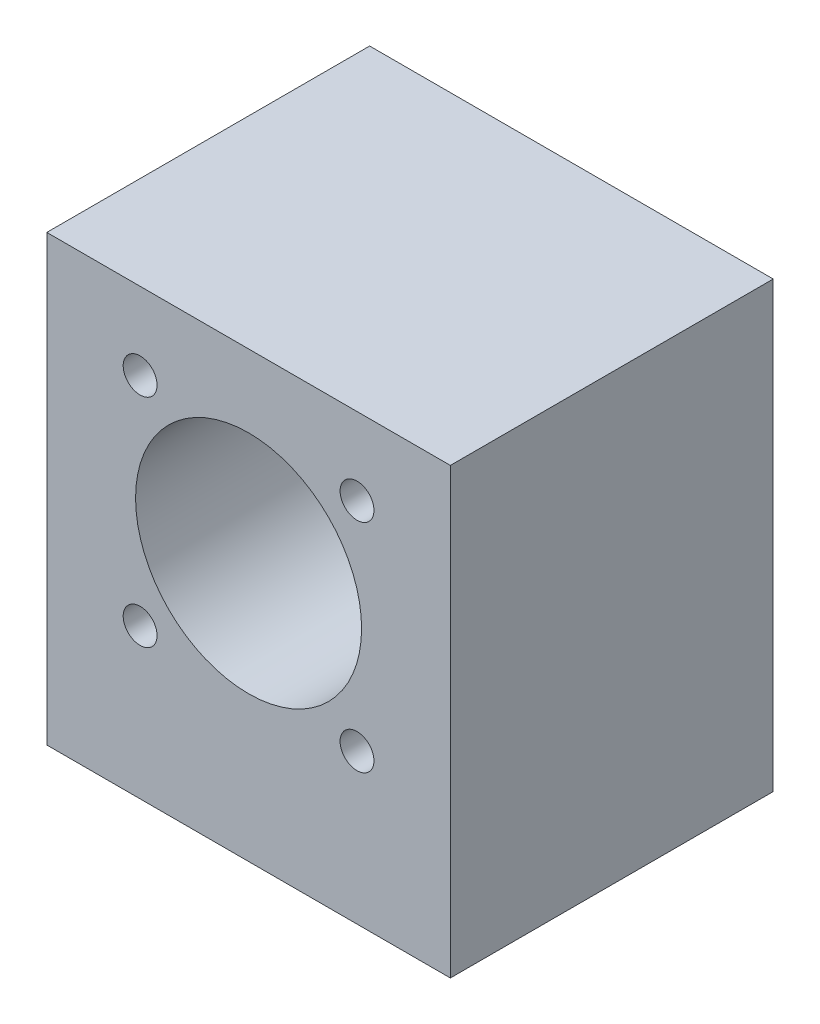
ISO-10303-21;
HEADER;
FILE_DESCRIPTION(('STEP AP214'),'2;1');
FILE_NAME('part.step','',(''),(''),'','','');
FILE_SCHEMA(('AUTOMOTIVE_DESIGN { 1 0 10303 214 1 1 1 1 }'));
ENDSEC;
DATA;
#1=APPLICATION_CONTEXT('core data for automotive mechanical design processes');
#2=APPLICATION_PROTOCOL_DEFINITION('international standard','automotive_design',2000,#1);
#3=PRODUCT_CONTEXT('',#1,'mechanical');
#4=PRODUCT('Part','Part','',(#3));
#5=PRODUCT_RELATED_PRODUCT_CATEGORY('part','',(#4));
#6=PRODUCT_DEFINITION_FORMATION('','',#4);
#7=PRODUCT_DEFINITION_CONTEXT('part definition',#1,'design');
#8=PRODUCT_DEFINITION('design','',#6,#7);
#9=PRODUCT_DEFINITION_SHAPE('','',#8);
#10=(LENGTH_UNIT() NAMED_UNIT(*) SI_UNIT(.MILLI.,.METRE.));
#11=(NAMED_UNIT(*) PLANE_ANGLE_UNIT() SI_UNIT($,.RADIAN.));
#12=(NAMED_UNIT(*) SI_UNIT($,.STERADIAN.) SOLID_ANGLE_UNIT());
#13=UNCERTAINTY_MEASURE_WITH_UNIT(LENGTH_MEASURE(1.E-05),#10,'distance_accuracy_value','');
#14=(GEOMETRIC_REPRESENTATION_CONTEXT(3) GLOBAL_UNCERTAINTY_ASSIGNED_CONTEXT((#13)) GLOBAL_UNIT_ASSIGNED_CONTEXT((#10,
#11,#12)) REPRESENTATION_CONTEXT('',''));
#15=CARTESIAN_POINT('',(0.,0.,0.));
#16=DIRECTION('',(0.,0.,1.));
#17=DIRECTION('',(1.,0.,0.));
#18=AXIS2_PLACEMENT_3D('',#15,#16,#17);
#19=CARTESIAN_POINT('',(-25.,-27.5,-40.));
#20=DIRECTION('',(-1.,0.,0.));
#21=DIRECTION('',(0.,0.,1.));
#22=AXIS2_PLACEMENT_3D('',#19,#20,#21);
#23=PLANE('',#22);
#24=DIRECTION('',(0.,-1.,0.));
#25=VECTOR('',#24,1.);
#26=CARTESIAN_POINT('',(-25.,-27.5,0.));
#27=LINE('',#26,#25);
#28=CARTESIAN_POINT('',(-25.,27.5,0.));
#29=VERTEX_POINT('',#28);
#30=CARTESIAN_POINT('',(-25.,-27.5,0.));
#31=VERTEX_POINT('',#30);
#32=EDGE_CURVE('E168',#29,#31,#27,.T.);
#33=ORIENTED_EDGE('',*,*,#32,.F.);
#34=DIRECTION('',(0.,0.,1.));
#35=VECTOR('',#34,1.);
#36=CARTESIAN_POINT('',(-25.,27.5,-40.));
#37=LINE('',#36,#35);
#38=CARTESIAN_POINT('',(-25.,27.5,-40.));
#39=VERTEX_POINT('',#38);
#40=EDGE_CURVE('E11',#39,#29,#37,.T.);
#41=ORIENTED_EDGE('',*,*,#40,.F.);
#42=DIRECTION('',(0.,-1.,0.));
#43=VECTOR('',#42,1.);
#44=CARTESIAN_POINT('',(-25.,-27.5,-40.));
#45=LINE('',#44,#43);
#46=CARTESIAN_POINT('',(-25.,-27.5,-40.));
#47=VERTEX_POINT('',#46);
#48=EDGE_CURVE('E171',#39,#47,#45,.T.);
#49=ORIENTED_EDGE('',*,*,#48,.T.);
#50=DIRECTION('',(0.,0.,1.));
#51=VECTOR('',#50,1.);
#52=CARTESIAN_POINT('',(-25.,-27.5,-40.));
#53=LINE('',#52,#51);
#54=EDGE_CURVE('E40',#47,#31,#53,.T.);
#55=ORIENTED_EDGE('',*,*,#54,.T.);
#56=EDGE_LOOP('',(#33,#41,#49,#55));
#57=FACE_BOUND('',#56,.T.);
#58=ADVANCED_FACE('F37',(#57),#23,.T.);
#59=CARTESIAN_POINT('',(25.,27.5,-40.));
#60=DIRECTION('',(0.,1.,0.));
#61=DIRECTION('',(-1.,0.,0.));
#62=AXIS2_PLACEMENT_3D('',#59,#60,#61);
#63=PLANE('',#62);
#64=DIRECTION('',(-1.,0.,0.));
#65=VECTOR('',#64,1.);
#66=CARTESIAN_POINT('',(25.,27.5,0.));
#67=LINE('',#66,#65);
#68=CARTESIAN_POINT('',(25.,27.5,0.));
#69=VERTEX_POINT('',#68);
#70=EDGE_CURVE('E174',#69,#29,#67,.T.);
#71=ORIENTED_EDGE('',*,*,#70,.F.);
#72=DIRECTION('',(0.,0.,1.));
#73=VECTOR('',#72,1.);
#74=CARTESIAN_POINT('',(25.,27.5,-40.));
#75=LINE('',#74,#73);
#76=CARTESIAN_POINT('',(25.,27.5,-40.));
#77=VERTEX_POINT('',#76);
#78=EDGE_CURVE('E46',#77,#69,#75,.T.);
#79=ORIENTED_EDGE('',*,*,#78,.F.);
#80=DIRECTION('',(-1.,0.,0.));
#81=VECTOR('',#80,1.);
#82=CARTESIAN_POINT('',(25.,27.5,-40.));
#83=LINE('',#82,#81);
#84=EDGE_CURVE('E178',#77,#39,#83,.T.);
#85=ORIENTED_EDGE('',*,*,#84,.T.);
#86=ORIENTED_EDGE('',*,*,#40,.T.);
#87=EDGE_LOOP('',(#71,#79,#85,#86));
#88=FACE_BOUND('',#87,.T.);
#89=ADVANCED_FACE('F193',(#88),#63,.T.);
#90=CARTESIAN_POINT('',(25.,-27.5,-40.));
#91=DIRECTION('',(1.,0.,0.));
#92=DIRECTION('',(0.,0.,-1.));
#93=AXIS2_PLACEMENT_3D('',#90,#91,#92);
#94=PLANE('',#93);
#95=DIRECTION('',(0.,1.,0.));
#96=VECTOR('',#95,1.);
#97=CARTESIAN_POINT('',(25.,-27.5,0.));
#98=LINE('',#97,#96);
#99=CARTESIAN_POINT('',(25.,-27.5,0.));
#100=VERTEX_POINT('',#99);
#101=EDGE_CURVE('E185',#100,#69,#98,.T.);
#102=ORIENTED_EDGE('',*,*,#101,.F.);
#103=DIRECTION('',(0.,0.,1.));
#104=VECTOR('',#103,1.);
#105=CARTESIAN_POINT('',(25.,-27.5,-40.));
#106=LINE('',#105,#104);
#107=CARTESIAN_POINT('',(25.,-27.5,-40.));
#108=VERTEX_POINT('',#107);
#109=EDGE_CURVE('E189',#108,#100,#106,.T.);
#110=ORIENTED_EDGE('',*,*,#109,.F.);
#111=DIRECTION('',(0.,1.,0.));
#112=VECTOR('',#111,1.);
#113=CARTESIAN_POINT('',(25.,-27.5,-40.));
#114=LINE('',#113,#112);
#115=EDGE_CURVE('E176',#108,#77,#114,.T.);
#116=ORIENTED_EDGE('',*,*,#115,.T.);
#117=ORIENTED_EDGE('',*,*,#78,.T.);
#118=EDGE_LOOP('',(#102,#110,#116,#117));
#119=FACE_BOUND('',#118,.T.);
#120=ADVANCED_FACE('F196',(#119),#94,.T.);
#121=CARTESIAN_POINT('',(25.,-27.5,-40.));
#122=DIRECTION('',(0.,-1.,0.));
#123=DIRECTION('',(1.,0.,0.));
#124=AXIS2_PLACEMENT_3D('',#121,#122,#123);
#125=PLANE('',#124);
#126=CARTESIAN_POINT('',(-9.99999999999999,-27.5,-10.));
#127=DIRECTION('',(0.,-1.,0.));
#128=DIRECTION('',(0.,0.,-1.));
#129=AXIS2_PLACEMENT_3D('',#126,#127,#128);
#130=CIRCLE('',#129,2.1);
#131=CARTESIAN_POINT('',(-9.99999999999999,-27.5,-12.1));
#132=VERTEX_POINT('',#131);
#133=EDGE_CURVE('E140',#132,#132,#130,.T.);
#134=ORIENTED_EDGE('',*,*,#133,.F.);
#135=EDGE_LOOP('',(#134));
#136=FACE_BOUND('',#135,.T.);
#137=CARTESIAN_POINT('',(10.,-27.5,-10.));
#138=DIRECTION('',(0.,-1.,0.));
#139=DIRECTION('',(0.,0.,-1.));
#140=AXIS2_PLACEMENT_3D('',#137,#138,#139);
#141=CIRCLE('',#140,2.1);
#142=CARTESIAN_POINT('',(10.,-27.5,-12.1));
#143=VERTEX_POINT('',#142);
#144=EDGE_CURVE('E146',#143,#143,#141,.T.);
#145=ORIENTED_EDGE('',*,*,#144,.F.);
#146=EDGE_LOOP('',(#145));
#147=FACE_BOUND('',#146,.T.);
#148=CARTESIAN_POINT('',(10.,-27.5,-30.));
#149=DIRECTION('',(0.,-1.,0.));
#150=DIRECTION('',(0.,0.,-1.));
#151=AXIS2_PLACEMENT_3D('',#148,#149,#150);
#152=CIRCLE('',#151,2.1);
#153=CARTESIAN_POINT('',(10.,-27.5,-32.1));
#154=VERTEX_POINT('',#153);
#155=EDGE_CURVE('E152',#154,#154,#152,.T.);
#156=ORIENTED_EDGE('',*,*,#155,.F.);
#157=EDGE_LOOP('',(#156));
#158=FACE_BOUND('',#157,.T.);
#159=CARTESIAN_POINT('',(-9.99999999999999,-27.5,-30.));
#160=DIRECTION('',(0.,-1.,0.));
#161=DIRECTION('',(0.,0.,-1.));
#162=AXIS2_PLACEMENT_3D('',#159,#160,#161);
#163=CIRCLE('',#162,2.1);
#164=CARTESIAN_POINT('',(-9.99999999999999,-27.5,-32.1));
#165=VERTEX_POINT('',#164);
#166=EDGE_CURVE('E158',#165,#165,#163,.T.);
#167=ORIENTED_EDGE('',*,*,#166,.F.);
#168=EDGE_LOOP('',(#167));
#169=FACE_BOUND('',#168,.T.);
#170=DIRECTION('',(1.,0.,0.));
#171=VECTOR('',#170,1.);
#172=CARTESIAN_POINT('',(25.,-27.5,0.));
#173=LINE('',#172,#171);
#174=EDGE_CURVE('E182',#31,#100,#173,.T.);
#175=ORIENTED_EDGE('',*,*,#174,.F.);
#176=ORIENTED_EDGE('',*,*,#54,.F.);
#177=DIRECTION('',(1.,0.,0.));
#178=VECTOR('',#177,1.);
#179=CARTESIAN_POINT('',(25.,-27.5,-40.));
#180=LINE('',#179,#178);
#181=EDGE_CURVE('E173',#47,#108,#180,.T.);
#182=ORIENTED_EDGE('',*,*,#181,.T.);
#183=ORIENTED_EDGE('',*,*,#109,.T.);
#184=EDGE_LOOP('',(#175,#176,#182,#183));
#185=FACE_BOUND('',#184,.T.);
#186=ADVANCED_FACE('F190',(#136,#147,#158,#169,#185),#125,.T.);
#187=CARTESIAN_POINT('',(0.,0.,-40.));
#188=DIRECTION('',(0.,0.,1.));
#189=DIRECTION('',(1.,0.,0.));
#190=AXIS2_PLACEMENT_3D('',#187,#188,#189);
#191=PLANE('',#190);
#192=CARTESIAN_POINT('',(0.,4.49999999999999,-40.));
#193=DIRECTION('',(0.,0.,1.));
#194=DIRECTION('',(1.,0.,0.));
#195=AXIS2_PLACEMENT_3D('',#192,#193,#194);
#196=CIRCLE('',#195,14.);
#197=CARTESIAN_POINT('',(14.,4.49999999999999,-40.));
#198=VERTEX_POINT('',#197);
#199=EDGE_CURVE('E165',#198,#198,#196,.T.);
#200=ORIENTED_EDGE('',*,*,#199,.T.);
#201=EDGE_LOOP('',(#200));
#202=FACE_BOUND('',#201,.T.);
#203=ORIENTED_EDGE('',*,*,#48,.F.);
#204=ORIENTED_EDGE('',*,*,#84,.F.);
#205=ORIENTED_EDGE('',*,*,#115,.F.);
#206=ORIENTED_EDGE('',*,*,#181,.F.);
#207=EDGE_LOOP('',(#203,#204,#205,#206));
#208=FACE_BOUND('',#207,.T.);
#209=ADVANCED_FACE('F198',(#202,#208),#191,.F.);
#210=CARTESIAN_POINT('',(0.,0.,0.));
#211=DIRECTION('',(0.,0.,1.));
#212=DIRECTION('',(1.,0.,0.));
#213=AXIS2_PLACEMENT_3D('',#210,#211,#212);
#214=PLANE('',#213);
#215=CARTESIAN_POINT('',(13.4350288425444,17.9350288425444,0.));
#216=DIRECTION('',(0.,0.,1.));
#217=DIRECTION('',(1.,0.,0.));
#218=AXIS2_PLACEMENT_3D('',#215,#216,#217);
#219=CIRCLE('',#218,2.09999999999999);
#220=CARTESIAN_POINT('',(15.5350288425444,17.9350288425444,0.));
#221=VERTEX_POINT('',#220);
#222=EDGE_CURVE('E118',#221,#221,#219,.T.);
#223=ORIENTED_EDGE('',*,*,#222,.F.);
#224=EDGE_LOOP('',(#223));
#225=FACE_BOUND('',#224,.T.);
#226=CARTESIAN_POINT('',(13.4350288425444,-8.93502884254443,0.));
#227=DIRECTION('',(0.,0.,1.));
#228=DIRECTION('',(1.,0.,0.));
#229=AXIS2_PLACEMENT_3D('',#226,#227,#228);
#230=CIRCLE('',#229,2.09999999999999);
#231=CARTESIAN_POINT('',(15.5350288425444,-8.93502884254443,0.));
#232=VERTEX_POINT('',#231);
#233=EDGE_CURVE('E117',#232,#232,#230,.T.);
#234=ORIENTED_EDGE('',*,*,#233,.F.);
#235=EDGE_LOOP('',(#234));
#236=FACE_BOUND('',#235,.T.);
#237=CARTESIAN_POINT('',(-13.4350288425444,-8.93502884254443,0.));
#238=DIRECTION('',(0.,0.,1.));
#239=DIRECTION('',(1.,0.,0.));
#240=AXIS2_PLACEMENT_3D('',#237,#238,#239);
#241=CIRCLE('',#240,2.09999999999999);
#242=CARTESIAN_POINT('',(-11.3350288425444,-8.93502884254443,0.));
#243=VERTEX_POINT('',#242);
#244=EDGE_CURVE('E128',#243,#243,#241,.T.);
#245=ORIENTED_EDGE('',*,*,#244,.F.);
#246=EDGE_LOOP('',(#245));
#247=FACE_BOUND('',#246,.T.);
#248=CARTESIAN_POINT('',(-13.4350288425444,17.9350288425444,0.));
#249=DIRECTION('',(0.,0.,1.));
#250=DIRECTION('',(1.,0.,0.));
#251=AXIS2_PLACEMENT_3D('',#248,#249,#250);
#252=CIRCLE('',#251,2.09999999999999);
#253=CARTESIAN_POINT('',(-11.3350288425444,17.9350288425444,0.));
#254=VERTEX_POINT('',#253);
#255=EDGE_CURVE('E134',#254,#254,#252,.T.);
#256=ORIENTED_EDGE('',*,*,#255,.F.);
#257=EDGE_LOOP('',(#256));
#258=FACE_BOUND('',#257,.T.);
#259=CARTESIAN_POINT('',(0.,4.49999999999999,0.));
#260=DIRECTION('',(0.,0.,1.));
#261=DIRECTION('',(1.,0.,0.));
#262=AXIS2_PLACEMENT_3D('',#259,#260,#261);
#263=CIRCLE('',#262,14.);
#264=CARTESIAN_POINT('',(14.,4.49999999999999,0.));
#265=VERTEX_POINT('',#264);
#266=EDGE_CURVE('E164',#265,#265,#263,.T.);
#267=ORIENTED_EDGE('',*,*,#266,.F.);
#268=EDGE_LOOP('',(#267));
#269=FACE_BOUND('',#268,.T.);
#270=ORIENTED_EDGE('',*,*,#32,.T.);
#271=ORIENTED_EDGE('',*,*,#174,.T.);
#272=ORIENTED_EDGE('',*,*,#101,.T.);
#273=ORIENTED_EDGE('',*,*,#70,.T.);
#274=EDGE_LOOP('',(#270,#271,#272,#273));
#275=FACE_BOUND('',#274,.T.);
#276=ADVANCED_FACE('F192',(#225,#236,#247,#258,#269,#275),#214,.T.);
#277=CARTESIAN_POINT('',(0.,4.49999999999999,-40.));
#278=DIRECTION('',(0.,0.,1.));
#279=DIRECTION('',(1.,0.,0.));
#280=AXIS2_PLACEMENT_3D('',#277,#278,#279);
#281=CYLINDRICAL_SURFACE('',#280,14.);
#282=ORIENTED_EDGE('',*,*,#199,.F.);
#283=EDGE_LOOP('',(#282));
#284=FACE_BOUND('',#283,.T.);
#285=ORIENTED_EDGE('',*,*,#266,.T.);
#286=EDGE_LOOP('',(#285));
#287=FACE_BOUND('',#286,.T.);
#288=ADVANCED_FACE('F206',(#284,#287),#281,.F.);
#289=CARTESIAN_POINT('',(-9.99999999999999,-12.5,-30.));
#290=DIRECTION('',(0.,-1.,0.));
#291=DIRECTION('',(0.,0.,-1.));
#292=AXIS2_PLACEMENT_3D('',#289,#290,#291);
#293=CONICAL_SURFACE('',#292,2.1,1.02974425867665);
#294=CARTESIAN_POINT('',(-10.,-11.2381927000421,-30.));
#295=VERTEX_POINT('',#294);
#296=VERTEX_LOOP('',#295);
#297=FACE_BOUND('',#296,.T.);
#298=CARTESIAN_POINT('',(-9.99999999999999,-12.5,-30.));
#299=DIRECTION('',(0.,-1.,0.));
#300=DIRECTION('',(0.,0.,-1.));
#301=AXIS2_PLACEMENT_3D('',#298,#299,#300);
#302=CIRCLE('',#301,2.1);
#303=CARTESIAN_POINT('',(-9.99999999999999,-12.5,-32.1));
#304=VERTEX_POINT('',#303);
#305=EDGE_CURVE('E161',#304,#304,#302,.T.);
#306=ORIENTED_EDGE('',*,*,#305,.T.);
#307=EDGE_LOOP('',(#306));
#308=FACE_BOUND('',#307,.T.);
#309=ADVANCED_FACE('F236',(#297,#308),#293,.F.);
#310=CARTESIAN_POINT('',(-9.99999999999999,-27.5,-30.));
#311=DIRECTION('',(0.,-1.,0.));
#312=DIRECTION('',(0.,0.,-1.));
#313=AXIS2_PLACEMENT_3D('',#310,#311,#312);
#314=CYLINDRICAL_SURFACE('',#313,2.1);
#315=ORIENTED_EDGE('',*,*,#305,.F.);
#316=EDGE_LOOP('',(#315));
#317=FACE_BOUND('',#316,.T.);
#318=ORIENTED_EDGE('',*,*,#166,.T.);
#319=EDGE_LOOP('',(#318));
#320=FACE_BOUND('',#319,.T.);
#321=ADVANCED_FACE('F241',(#317,#320),#314,.F.);
#322=CARTESIAN_POINT('',(10.,-12.5,-30.));
#323=DIRECTION('',(0.,-1.,0.));
#324=DIRECTION('',(0.,0.,-1.));
#325=AXIS2_PLACEMENT_3D('',#322,#323,#324);
#326=CONICAL_SURFACE('',#325,2.1,1.02974425867665);
#327=CARTESIAN_POINT('',(10.,-11.2381927000421,-30.));
#328=VERTEX_POINT('',#327);
#329=VERTEX_LOOP('',#328);
#330=FACE_BOUND('',#329,.T.);
#331=CARTESIAN_POINT('',(10.,-12.5,-30.));
#332=DIRECTION('',(0.,-1.,0.));
#333=DIRECTION('',(0.,0.,-1.));
#334=AXIS2_PLACEMENT_3D('',#331,#332,#333);
#335=CIRCLE('',#334,2.1);
#336=CARTESIAN_POINT('',(10.,-12.5,-32.1));
#337=VERTEX_POINT('',#336);
#338=EDGE_CURVE('E155',#337,#337,#335,.T.);
#339=ORIENTED_EDGE('',*,*,#338,.T.);
#340=EDGE_LOOP('',(#339));
#341=FACE_BOUND('',#340,.T.);
#342=ADVANCED_FACE('F252',(#330,#341),#326,.F.);
#343=CARTESIAN_POINT('',(10.,-27.5,-30.));
#344=DIRECTION('',(0.,-1.,0.));
#345=DIRECTION('',(0.,0.,-1.));
#346=AXIS2_PLACEMENT_3D('',#343,#344,#345);
#347=CYLINDRICAL_SURFACE('',#346,2.1);
#348=ORIENTED_EDGE('',*,*,#338,.F.);
#349=EDGE_LOOP('',(#348));
#350=FACE_BOUND('',#349,.T.);
#351=ORIENTED_EDGE('',*,*,#155,.T.);
#352=EDGE_LOOP('',(#351));
#353=FACE_BOUND('',#352,.T.);
#354=ADVANCED_FACE('F264',(#350,#353),#347,.F.);
#355=CARTESIAN_POINT('',(10.,-12.5,-10.));
#356=DIRECTION('',(0.,-1.,0.));
#357=DIRECTION('',(0.,0.,-1.));
#358=AXIS2_PLACEMENT_3D('',#355,#356,#357);
#359=CONICAL_SURFACE('',#358,2.1,1.02974425867665);
#360=CARTESIAN_POINT('',(10.,-11.2381927000421,-10.));
#361=VERTEX_POINT('',#360);
#362=VERTEX_LOOP('',#361);
#363=FACE_BOUND('',#362,.T.);
#364=CARTESIAN_POINT('',(10.,-12.5,-10.));
#365=DIRECTION('',(0.,-1.,0.));
#366=DIRECTION('',(0.,0.,-1.));
#367=AXIS2_PLACEMENT_3D('',#364,#365,#366);
#368=CIRCLE('',#367,2.1);
#369=CARTESIAN_POINT('',(10.,-12.5,-12.1));
#370=VERTEX_POINT('',#369);
#371=EDGE_CURVE('E149',#370,#370,#368,.T.);
#372=ORIENTED_EDGE('',*,*,#371,.T.);
#373=EDGE_LOOP('',(#372));
#374=FACE_BOUND('',#373,.T.);
#375=ADVANCED_FACE('F274',(#363,#374),#359,.F.);
#376=CARTESIAN_POINT('',(10.,-27.5,-10.));
#377=DIRECTION('',(0.,-1.,0.));
#378=DIRECTION('',(0.,0.,-1.));
#379=AXIS2_PLACEMENT_3D('',#376,#377,#378);
#380=CYLINDRICAL_SURFACE('',#379,2.1);
#381=ORIENTED_EDGE('',*,*,#371,.F.);
#382=EDGE_LOOP('',(#381));
#383=FACE_BOUND('',#382,.T.);
#384=ORIENTED_EDGE('',*,*,#144,.T.);
#385=EDGE_LOOP('',(#384));
#386=FACE_BOUND('',#385,.T.);
#387=ADVANCED_FACE('F286',(#383,#386),#380,.F.);
#388=CARTESIAN_POINT('',(-9.99999999999999,-12.5,-10.));
#389=DIRECTION('',(0.,-1.,0.));
#390=DIRECTION('',(0.,0.,-1.));
#391=AXIS2_PLACEMENT_3D('',#388,#389,#390);
#392=CONICAL_SURFACE('',#391,2.1,1.02974425867665);
#393=CARTESIAN_POINT('',(-10.,-11.2381927000421,-10.));
#394=VERTEX_POINT('',#393);
#395=VERTEX_LOOP('',#394);
#396=FACE_BOUND('',#395,.T.);
#397=CARTESIAN_POINT('',(-9.99999999999999,-12.5,-10.));
#398=DIRECTION('',(0.,-1.,0.));
#399=DIRECTION('',(0.,0.,-1.));
#400=AXIS2_PLACEMENT_3D('',#397,#398,#399);
#401=CIRCLE('',#400,2.1);
#402=CARTESIAN_POINT('',(-9.99999999999999,-12.5,-12.1));
#403=VERTEX_POINT('',#402);
#404=EDGE_CURVE('E143',#403,#403,#401,.T.);
#405=ORIENTED_EDGE('',*,*,#404,.T.);
#406=EDGE_LOOP('',(#405));
#407=FACE_BOUND('',#406,.T.);
#408=ADVANCED_FACE('F296',(#396,#407),#392,.F.);
#409=CARTESIAN_POINT('',(-9.99999999999999,-27.5,-10.));
#410=DIRECTION('',(0.,-1.,0.));
#411=DIRECTION('',(0.,0.,-1.));
#412=AXIS2_PLACEMENT_3D('',#409,#410,#411);
#413=CYLINDRICAL_SURFACE('',#412,2.1);
#414=ORIENTED_EDGE('',*,*,#404,.F.);
#415=EDGE_LOOP('',(#414));
#416=FACE_BOUND('',#415,.T.);
#417=ORIENTED_EDGE('',*,*,#133,.T.);
#418=EDGE_LOOP('',(#417));
#419=FACE_BOUND('',#418,.T.);
#420=ADVANCED_FACE('F308',(#416,#419),#413,.F.);
#421=CARTESIAN_POINT('',(-13.4350288425444,17.9350288425444,-17.4));
#422=DIRECTION('',(0.,0.,1.));
#423=DIRECTION('',(1.,0.,0.));
#424=AXIS2_PLACEMENT_3D('',#421,#422,#423);
#425=CONICAL_SURFACE('',#424,2.09999999999999,1.02974425867665);
#426=CARTESIAN_POINT('',(-13.4350288425444,17.9350288425444,-18.6618072999579));
#427=VERTEX_POINT('',#426);
#428=VERTEX_LOOP('',#427);
#429=FACE_BOUND('',#428,.T.);
#430=CARTESIAN_POINT('',(-13.4350288425444,17.9350288425444,-17.4));
#431=DIRECTION('',(0.,0.,1.));
#432=DIRECTION('',(1.,0.,0.));
#433=AXIS2_PLACEMENT_3D('',#430,#431,#432);
#434=CIRCLE('',#433,2.09999999999999);
#435=CARTESIAN_POINT('',(-11.3350288425444,17.9350288425444,-17.4));
#436=VERTEX_POINT('',#435);
#437=EDGE_CURVE('E137',#436,#436,#434,.T.);
#438=ORIENTED_EDGE('',*,*,#437,.T.);
#439=EDGE_LOOP('',(#438));
#440=FACE_BOUND('',#439,.T.);
#441=ADVANCED_FACE('F318',(#429,#440),#425,.F.);
#442=CARTESIAN_POINT('',(-13.4350288425444,17.9350288425444,0.));
#443=DIRECTION('',(0.,0.,1.));
#444=DIRECTION('',(1.,0.,0.));
#445=AXIS2_PLACEMENT_3D('',#442,#443,#444);
#446=CYLINDRICAL_SURFACE('',#445,2.09999999999999);
#447=ORIENTED_EDGE('',*,*,#437,.F.);
#448=EDGE_LOOP('',(#447));
#449=FACE_BOUND('',#448,.T.);
#450=ORIENTED_EDGE('',*,*,#255,.T.);
#451=EDGE_LOOP('',(#450));
#452=FACE_BOUND('',#451,.T.);
#453=ADVANCED_FACE('F335',(#449,#452),#446,.F.);
#454=CARTESIAN_POINT('',(-13.4350288425444,-8.93502884254443,-17.4));
#455=DIRECTION('',(0.,0.,1.));
#456=DIRECTION('',(1.,0.,0.));
#457=AXIS2_PLACEMENT_3D('',#454,#455,#456);
#458=CONICAL_SURFACE('',#457,2.09999999999999,1.02974425867665);
#459=CARTESIAN_POINT('',(-13.4350288425444,-8.93502884254443,-18.6618072999579));
#460=VERTEX_POINT('',#459);
#461=VERTEX_LOOP('',#460);
#462=FACE_BOUND('',#461,.T.);
#463=CARTESIAN_POINT('',(-13.4350288425444,-8.93502884254443,-17.4));
#464=DIRECTION('',(0.,0.,1.));
#465=DIRECTION('',(1.,0.,0.));
#466=AXIS2_PLACEMENT_3D('',#463,#464,#465);
#467=CIRCLE('',#466,2.09999999999999);
#468=CARTESIAN_POINT('',(-11.3350288425444,-8.93502884254443,-17.4));
#469=VERTEX_POINT('',#468);
#470=EDGE_CURVE('E131',#469,#469,#467,.T.);
#471=ORIENTED_EDGE('',*,*,#470,.T.);
#472=EDGE_LOOP('',(#471));
#473=FACE_BOUND('',#472,.T.);
#474=ADVANCED_FACE('F345',(#462,#473),#458,.F.);
#475=CARTESIAN_POINT('',(-13.4350288425444,-8.93502884254443,0.));
#476=DIRECTION('',(0.,0.,1.));
#477=DIRECTION('',(1.,0.,0.));
#478=AXIS2_PLACEMENT_3D('',#475,#476,#477);
#479=CYLINDRICAL_SURFACE('',#478,2.09999999999999);
#480=ORIENTED_EDGE('',*,*,#470,.F.);
#481=EDGE_LOOP('',(#480));
#482=FACE_BOUND('',#481,.T.);
#483=ORIENTED_EDGE('',*,*,#244,.T.);
#484=EDGE_LOOP('',(#483));
#485=FACE_BOUND('',#484,.T.);
#486=ADVANCED_FACE('F355',(#482,#485),#479,.F.);
#487=CARTESIAN_POINT('',(13.4350288425444,-8.93502884254443,-17.4));
#488=DIRECTION('',(0.,0.,1.));
#489=DIRECTION('',(1.,0.,0.));
#490=AXIS2_PLACEMENT_3D('',#487,#488,#489);
#491=CONICAL_SURFACE('',#490,2.09999999999999,1.02974425867665);
#492=CARTESIAN_POINT('',(13.4350288425444,-8.93502884254443,-18.6618072999579));
#493=VERTEX_POINT('',#492);
#494=VERTEX_LOOP('',#493);
#495=FACE_BOUND('',#494,.T.);
#496=CARTESIAN_POINT('',(13.4350288425444,-8.93502884254443,-17.4));
#497=DIRECTION('',(0.,0.,1.));
#498=DIRECTION('',(1.,0.,0.));
#499=AXIS2_PLACEMENT_3D('',#496,#497,#498);
#500=CIRCLE('',#499,2.09999999999999);
#501=CARTESIAN_POINT('',(15.5350288425444,-8.93502884254443,-17.4));
#502=VERTEX_POINT('',#501);
#503=EDGE_CURVE('E121',#502,#502,#500,.T.);
#504=ORIENTED_EDGE('',*,*,#503,.T.);
#505=EDGE_LOOP('',(#504));
#506=FACE_BOUND('',#505,.T.);
#507=ADVANCED_FACE('F365',(#495,#506),#491,.F.);
#508=CARTESIAN_POINT('',(13.4350288425444,-8.93502884254443,0.));
#509=DIRECTION('',(0.,0.,1.));
#510=DIRECTION('',(1.,0.,0.));
#511=AXIS2_PLACEMENT_3D('',#508,#509,#510);
#512=CYLINDRICAL_SURFACE('',#511,2.09999999999999);
#513=ORIENTED_EDGE('',*,*,#503,.F.);
#514=EDGE_LOOP('',(#513));
#515=FACE_BOUND('',#514,.T.);
#516=ORIENTED_EDGE('',*,*,#233,.T.);
#517=EDGE_LOOP('',(#516));
#518=FACE_BOUND('',#517,.T.);
#519=ADVANCED_FACE('F111',(#515,#518),#512,.F.);
#520=CARTESIAN_POINT('',(13.4350288425444,17.9350288425444,-17.4));
#521=DIRECTION('',(0.,0.,1.));
#522=DIRECTION('',(1.,0.,0.));
#523=AXIS2_PLACEMENT_3D('',#520,#521,#522);
#524=CONICAL_SURFACE('',#523,2.09999999999999,1.02974425867665);
#525=CARTESIAN_POINT('',(13.4350288425444,17.9350288425444,-18.6618072999579));
#526=VERTEX_POINT('',#525);
#527=VERTEX_LOOP('',#526);
#528=FACE_BOUND('',#527,.T.);
#529=CARTESIAN_POINT('',(13.4350288425444,17.9350288425444,-17.4));
#530=DIRECTION('',(0.,0.,1.));
#531=DIRECTION('',(1.,0.,0.));
#532=AXIS2_PLACEMENT_3D('',#529,#530,#531);
#533=CIRCLE('',#532,2.09999999999999);
#534=CARTESIAN_POINT('',(15.5350288425444,17.9350288425444,-17.4));
#535=VERTEX_POINT('',#534);
#536=EDGE_CURVE('E115',#535,#535,#533,.T.);
#537=ORIENTED_EDGE('',*,*,#536,.T.);
#538=EDGE_LOOP('',(#537));
#539=FACE_BOUND('',#538,.T.);
#540=ADVANCED_FACE('F107',(#528,#539),#524,.F.);
#541=CARTESIAN_POINT('',(13.4350288425444,17.9350288425444,0.));
#542=DIRECTION('',(0.,0.,1.));
#543=DIRECTION('',(1.,0.,0.));
#544=AXIS2_PLACEMENT_3D('',#541,#542,#543);
#545=CYLINDRICAL_SURFACE('',#544,2.09999999999999);
#546=ORIENTED_EDGE('',*,*,#536,.F.);
#547=EDGE_LOOP('',(#546));
#548=FACE_BOUND('',#547,.T.);
#549=ORIENTED_EDGE('',*,*,#222,.T.);
#550=EDGE_LOOP('',(#549));
#551=FACE_BOUND('',#550,.T.);
#552=ADVANCED_FACE('F110',(#548,#551),#545,.F.);
#553=CLOSED_SHELL('',(#58,#89,#120,#186,#209,#276,#288,#309,#321,#342,#354,#375,#387,#408,#420,
#441,#453,#474,#486,#507,#519,#540,#552));
#554=MANIFOLD_SOLID_BREP('B2',#553);
#555=ADVANCED_BREP_SHAPE_REPRESENTATION('',(#18,#554),#14);
#556=SHAPE_DEFINITION_REPRESENTATION(#9,#555);
ENDSEC;
END-ISO-10303-21;
